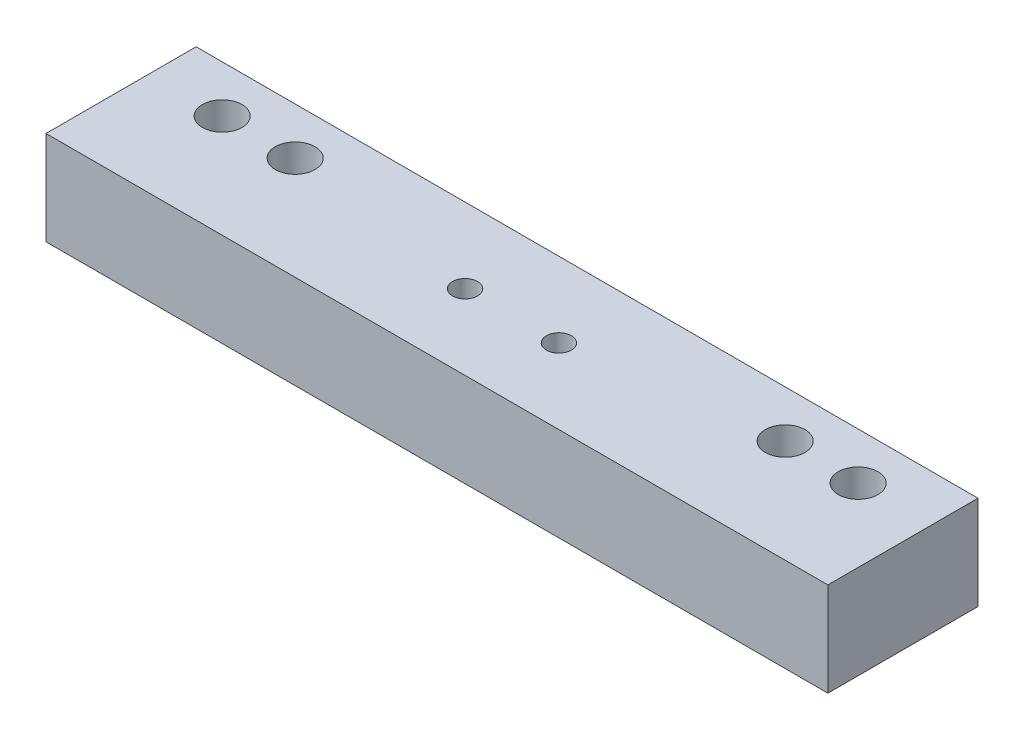
ISO-10303-21;
HEADER;
FILE_DESCRIPTION(('STEP AP214'),'2;1');
FILE_NAME('part.step','',(''),(''),'','','');
FILE_SCHEMA(('AUTOMOTIVE_DESIGN { 1 0 10303 214 1 1 1 1 }'));
ENDSEC;
DATA;
#1=APPLICATION_CONTEXT('core data for automotive mechanical design processes');
#2=APPLICATION_PROTOCOL_DEFINITION('international standard','automotive_design',2000,#1);
#3=PRODUCT_CONTEXT('',#1,'mechanical');
#4=PRODUCT('Part','Part','',(#3));
#5=PRODUCT_RELATED_PRODUCT_CATEGORY('part','',(#4));
#6=PRODUCT_DEFINITION_FORMATION('','',#4);
#7=PRODUCT_DEFINITION_CONTEXT('part definition',#1,'design');
#8=PRODUCT_DEFINITION('design','',#6,#7);
#9=PRODUCT_DEFINITION_SHAPE('','',#8);
#10=(LENGTH_UNIT() NAMED_UNIT(*) SI_UNIT(.MILLI.,.METRE.));
#11=(NAMED_UNIT(*) PLANE_ANGLE_UNIT() SI_UNIT($,.RADIAN.));
#12=(NAMED_UNIT(*) SI_UNIT($,.STERADIAN.) SOLID_ANGLE_UNIT());
#13=UNCERTAINTY_MEASURE_WITH_UNIT(LENGTH_MEASURE(1.E-05),#10,'distance_accuracy_value','');
#14=(GEOMETRIC_REPRESENTATION_CONTEXT(3) GLOBAL_UNCERTAINTY_ASSIGNED_CONTEXT((#13)) GLOBAL_UNIT_ASSIGNED_CONTEXT((#10,
#11,#12)) REPRESENTATION_CONTEXT('',''));
#15=CARTESIAN_POINT('',(0.,0.,0.));
#16=DIRECTION('',(0.,0.,1.));
#17=DIRECTION('',(1.,0.,0.));
#18=AXIS2_PLACEMENT_3D('',#15,#16,#17);
#19=CARTESIAN_POINT('',(0.,15.,0.));
#20=DIRECTION('',(1.,0.,0.));
#21=DIRECTION('',(0.,0.,-1.));
#22=AXIS2_PLACEMENT_3D('',#19,#20,#21);
#23=PLANE('',#22);
#24=DIRECTION('',(0.,0.,1.));
#25=VECTOR('',#24,1.);
#26=CARTESIAN_POINT('',(0.,0.,0.));
#27=LINE('',#26,#25);
#28=CARTESIAN_POINT('',(0.,0.,-24.));
#29=VERTEX_POINT('',#28);
#30=CARTESIAN_POINT('',(0.,0.,0.));
#31=VERTEX_POINT('',#30);
#32=EDGE_CURVE('E95',#29,#31,#27,.T.);
#33=ORIENTED_EDGE('',*,*,#32,.T.);
#34=DIRECTION('',(0.,-1.,0.));
#35=VECTOR('',#34,1.);
#36=CARTESIAN_POINT('',(0.,15.,0.));
#37=LINE('',#36,#35);
#38=CARTESIAN_POINT('',(0.,15.,0.));
#39=VERTEX_POINT('',#38);
#40=EDGE_CURVE('E11',#39,#31,#37,.T.);
#41=ORIENTED_EDGE('',*,*,#40,.F.);
#42=DIRECTION('',(0.,0.,1.));
#43=VECTOR('',#42,1.);
#44=CARTESIAN_POINT('',(0.,15.,0.));
#45=LINE('',#44,#43);
#46=CARTESIAN_POINT('',(0.,15.,-24.));
#47=VERTEX_POINT('',#46);
#48=EDGE_CURVE('E83',#47,#39,#45,.T.);
#49=ORIENTED_EDGE('',*,*,#48,.F.);
#50=DIRECTION('',(0.,-1.,0.));
#51=VECTOR('',#50,1.);
#52=CARTESIAN_POINT('',(0.,15.,-24.));
#53=LINE('',#52,#51);
#54=EDGE_CURVE('E91',#47,#29,#53,.T.);
#55=ORIENTED_EDGE('',*,*,#54,.T.);
#56=EDGE_LOOP('',(#33,#41,#49,#55));
#57=FACE_BOUND('',#56,.T.);
#58=ADVANCED_FACE('F32',(#57),#23,.F.);
#59=CARTESIAN_POINT('',(0.,15.,0.));
#60=DIRECTION('',(0.,0.,-1.));
#61=DIRECTION('',(-1.,0.,0.));
#62=AXIS2_PLACEMENT_3D('',#59,#60,#61);
#63=PLANE('',#62);
#64=DIRECTION('',(1.,0.,0.));
#65=VECTOR('',#64,1.);
#66=CARTESIAN_POINT('',(0.,0.,0.));
#67=LINE('',#66,#65);
#68=CARTESIAN_POINT('',(125.,0.,0.));
#69=VERTEX_POINT('',#68);
#70=EDGE_CURVE('E87',#31,#69,#67,.T.);
#71=ORIENTED_EDGE('',*,*,#70,.T.);
#72=DIRECTION('',(0.,-1.,0.));
#73=VECTOR('',#72,1.);
#74=CARTESIAN_POINT('',(125.,15.,0.));
#75=LINE('',#74,#73);
#76=CARTESIAN_POINT('',(125.,15.,0.));
#77=VERTEX_POINT('',#76);
#78=EDGE_CURVE('E40',#77,#69,#75,.T.);
#79=ORIENTED_EDGE('',*,*,#78,.F.);
#80=DIRECTION('',(1.,0.,0.));
#81=VECTOR('',#80,1.);
#82=CARTESIAN_POINT('',(0.,15.,0.));
#83=LINE('',#82,#81);
#84=EDGE_CURVE('E78',#39,#77,#83,.T.);
#85=ORIENTED_EDGE('',*,*,#84,.F.);
#86=ORIENTED_EDGE('',*,*,#40,.T.);
#87=EDGE_LOOP('',(#71,#79,#85,#86));
#88=FACE_BOUND('',#87,.T.);
#89=ADVANCED_FACE('F86',(#88),#63,.F.);
#90=CARTESIAN_POINT('',(125.,15.,0.));
#91=DIRECTION('',(-1.,0.,0.));
#92=DIRECTION('',(0.,0.,1.));
#93=AXIS2_PLACEMENT_3D('',#90,#91,#92);
#94=PLANE('',#93);
#95=DIRECTION('',(0.,0.,-1.));
#96=VECTOR('',#95,1.);
#97=CARTESIAN_POINT('',(125.,0.,0.));
#98=LINE('',#97,#96);
#99=CARTESIAN_POINT('',(125.,0.,-24.));
#100=VERTEX_POINT('',#99);
#101=EDGE_CURVE('E65',#69,#100,#98,.T.);
#102=ORIENTED_EDGE('',*,*,#101,.T.);
#103=DIRECTION('',(0.,-1.,0.));
#104=VECTOR('',#103,1.);
#105=CARTESIAN_POINT('',(125.,15.,-24.));
#106=LINE('',#105,#104);
#107=CARTESIAN_POINT('',(125.,15.,-24.));
#108=VERTEX_POINT('',#107);
#109=EDGE_CURVE('E88',#108,#100,#106,.T.);
#110=ORIENTED_EDGE('',*,*,#109,.F.);
#111=DIRECTION('',(0.,0.,-1.));
#112=VECTOR('',#111,1.);
#113=CARTESIAN_POINT('',(125.,15.,0.));
#114=LINE('',#113,#112);
#115=EDGE_CURVE('E81',#77,#108,#114,.T.);
#116=ORIENTED_EDGE('',*,*,#115,.F.);
#117=ORIENTED_EDGE('',*,*,#78,.T.);
#118=EDGE_LOOP('',(#102,#110,#116,#117));
#119=FACE_BOUND('',#118,.T.);
#120=ADVANCED_FACE('F89',(#119),#94,.F.);
#121=CARTESIAN_POINT('',(0.,15.,-24.));
#122=DIRECTION('',(0.,0.,1.));
#123=DIRECTION('',(1.,0.,0.));
#124=AXIS2_PLACEMENT_3D('',#121,#122,#123);
#125=PLANE('',#124);
#126=DIRECTION('',(-1.,0.,0.));
#127=VECTOR('',#126,1.);
#128=CARTESIAN_POINT('',(0.,0.,-24.));
#129=LINE('',#128,#127);
#130=EDGE_CURVE('E71',#100,#29,#129,.T.);
#131=ORIENTED_EDGE('',*,*,#130,.T.);
#132=ORIENTED_EDGE('',*,*,#54,.F.);
#133=DIRECTION('',(-1.,0.,0.));
#134=VECTOR('',#133,1.);
#135=CARTESIAN_POINT('',(0.,15.,-24.));
#136=LINE('',#135,#134);
#137=EDGE_CURVE('E48',#108,#47,#136,.T.);
#138=ORIENTED_EDGE('',*,*,#137,.F.);
#139=ORIENTED_EDGE('',*,*,#109,.T.);
#140=EDGE_LOOP('',(#131,#132,#138,#139));
#141=FACE_BOUND('',#140,.T.);
#142=ADVANCED_FACE('F103',(#141),#125,.F.);
#143=CARTESIAN_POINT('',(0.,15.,0.));
#144=DIRECTION('',(0.,-1.,0.));
#145=DIRECTION('',(0.,0.,-1.));
#146=AXIS2_PLACEMENT_3D('',#143,#144,#145);
#147=PLANE('',#146);
#148=CARTESIAN_POINT('',(55.,15.,-12.));
#149=DIRECTION('',(0.,-1.,0.));
#150=DIRECTION('',(0.,0.,1.));
#151=AXIS2_PLACEMENT_3D('',#148,#149,#150);
#152=CIRCLE('',#151,2.);
#153=CARTESIAN_POINT('',(55.,15.,-10.));
#154=VERTEX_POINT('',#153);
#155=EDGE_CURVE('E139',#154,#154,#152,.T.);
#156=ORIENTED_EDGE('',*,*,#155,.T.);
#157=EDGE_LOOP('',(#156));
#158=FACE_BOUND('',#157,.T.);
#159=CARTESIAN_POINT('',(70.,15.,-12.));
#160=DIRECTION('',(0.,1.,0.));
#161=DIRECTION('',(0.,0.,1.));
#162=AXIS2_PLACEMENT_3D('',#159,#160,#161);
#163=CIRCLE('',#162,2.);
#164=CARTESIAN_POINT('',(70.,15.,-10.));
#165=VERTEX_POINT('',#164);
#166=EDGE_CURVE('E133',#165,#165,#163,.T.);
#167=ORIENTED_EDGE('',*,*,#166,.F.);
#168=EDGE_LOOP('',(#167));
#169=FACE_BOUND('',#168,.T.);
#170=CARTESIAN_POINT('',(11.6666666666667,15.,-16.5));
#171=DIRECTION('',(0.,-1.,0.));
#172=DIRECTION('',(0.,0.,-1.));
#173=AXIS2_PLACEMENT_3D('',#170,#171,#172);
#174=CIRCLE('',#173,3.175);
#175=CARTESIAN_POINT('',(11.6666666666667,15.,-19.675));
#176=VERTEX_POINT('',#175);
#177=EDGE_CURVE('E118',#176,#176,#174,.F.);
#178=ORIENTED_EDGE('',*,*,#177,.F.);
#179=EDGE_LOOP('',(#178));
#180=FACE_BOUND('',#179,.T.);
#181=CARTESIAN_POINT('',(23.3333333333333,15.,-16.5));
#182=DIRECTION('',(0.,-1.,0.));
#183=DIRECTION('',(0.,0.,-1.));
#184=AXIS2_PLACEMENT_3D('',#181,#182,#183);
#185=CIRCLE('',#184,3.175);
#186=CARTESIAN_POINT('',(23.3333333333333,15.,-19.675));
#187=VERTEX_POINT('',#186);
#188=EDGE_CURVE('E123',#187,#187,#185,.F.);
#189=ORIENTED_EDGE('',*,*,#188,.F.);
#190=EDGE_LOOP('',(#189));
#191=FACE_BOUND('',#190,.T.);
#192=CARTESIAN_POINT('',(113.333333333333,15.,-16.5));
#193=DIRECTION('',(0.,-1.,0.));
#194=DIRECTION('',(0.,0.,-1.));
#195=AXIS2_PLACEMENT_3D('',#192,#193,#194);
#196=CIRCLE('',#195,3.175);
#197=CARTESIAN_POINT('',(113.333333333333,15.,-19.675));
#198=VERTEX_POINT('',#197);
#199=EDGE_CURVE('E98',#198,#198,#196,.T.);
#200=ORIENTED_EDGE('',*,*,#199,.T.);
#201=EDGE_LOOP('',(#200));
#202=FACE_BOUND('',#201,.T.);
#203=CARTESIAN_POINT('',(101.666666666667,15.,-16.5));
#204=DIRECTION('',(0.,-1.,0.));
#205=DIRECTION('',(0.,0.,-1.));
#206=AXIS2_PLACEMENT_3D('',#203,#204,#205);
#207=CIRCLE('',#206,3.175);
#208=CARTESIAN_POINT('',(101.666666666667,15.,-19.675));
#209=VERTEX_POINT('',#208);
#210=EDGE_CURVE('E111',#209,#209,#207,.T.);
#211=ORIENTED_EDGE('',*,*,#210,.T.);
#212=EDGE_LOOP('',(#211));
#213=FACE_BOUND('',#212,.T.);
#214=ORIENTED_EDGE('',*,*,#48,.T.);
#215=ORIENTED_EDGE('',*,*,#84,.T.);
#216=ORIENTED_EDGE('',*,*,#115,.T.);
#217=ORIENTED_EDGE('',*,*,#137,.T.);
#218=EDGE_LOOP('',(#214,#215,#216,#217));
#219=FACE_BOUND('',#218,.T.);
#220=ADVANCED_FACE('F79',(#158,#169,#180,#191,#202,#213,#219),#147,.F.);
#221=CARTESIAN_POINT('',(0.,0.,0.));
#222=DIRECTION('',(0.,-1.,0.));
#223=DIRECTION('',(0.,0.,-1.));
#224=AXIS2_PLACEMENT_3D('',#221,#222,#223);
#225=PLANE('',#224);
#226=CARTESIAN_POINT('',(55.,0.,-12.));
#227=DIRECTION('',(0.,-1.,0.));
#228=DIRECTION('',(0.,0.,1.));
#229=AXIS2_PLACEMENT_3D('',#226,#227,#228);
#230=CIRCLE('',#229,2.);
#231=CARTESIAN_POINT('',(55.,0.,-10.));
#232=VERTEX_POINT('',#231);
#233=EDGE_CURVE('E136',#232,#232,#230,.T.);
#234=ORIENTED_EDGE('',*,*,#233,.F.);
#235=EDGE_LOOP('',(#234));
#236=FACE_BOUND('',#235,.T.);
#237=CARTESIAN_POINT('',(70.,0.,-12.));
#238=DIRECTION('',(0.,1.,0.));
#239=DIRECTION('',(0.,0.,1.));
#240=AXIS2_PLACEMENT_3D('',#237,#238,#239);
#241=CIRCLE('',#240,2.);
#242=CARTESIAN_POINT('',(70.,0.,-10.));
#243=VERTEX_POINT('',#242);
#244=EDGE_CURVE('E130',#243,#243,#241,.T.);
#245=ORIENTED_EDGE('',*,*,#244,.T.);
#246=EDGE_LOOP('',(#245));
#247=FACE_BOUND('',#246,.T.);
#248=CARTESIAN_POINT('',(11.6666666666667,0.,-16.5));
#249=DIRECTION('',(0.,-1.,0.));
#250=DIRECTION('',(0.,0.,1.));
#251=AXIS2_PLACEMENT_3D('',#248,#249,#250);
#252=CIRCLE('',#251,3.175);
#253=CARTESIAN_POINT('',(11.6666666666667,0.,-13.325));
#254=VERTEX_POINT('',#253);
#255=EDGE_CURVE('E126',#254,#254,#252,.T.);
#256=ORIENTED_EDGE('',*,*,#255,.F.);
#257=EDGE_LOOP('',(#256));
#258=FACE_BOUND('',#257,.T.);
#259=CARTESIAN_POINT('',(23.3333333333333,0.,-16.5));
#260=DIRECTION('',(0.,-1.,0.));
#261=DIRECTION('',(0.,0.,1.));
#262=AXIS2_PLACEMENT_3D('',#259,#260,#261);
#263=CIRCLE('',#262,3.175);
#264=CARTESIAN_POINT('',(23.3333333333333,0.,-13.325));
#265=VERTEX_POINT('',#264);
#266=EDGE_CURVE('E127',#265,#265,#263,.T.);
#267=ORIENTED_EDGE('',*,*,#266,.F.);
#268=EDGE_LOOP('',(#267));
#269=FACE_BOUND('',#268,.T.);
#270=CARTESIAN_POINT('',(113.333333333333,0.,-16.5));
#271=DIRECTION('',(0.,1.,0.));
#272=DIRECTION('',(0.,0.,1.));
#273=AXIS2_PLACEMENT_3D('',#270,#271,#272);
#274=CIRCLE('',#273,3.175);
#275=CARTESIAN_POINT('',(113.333333333333,0.,-13.325));
#276=VERTEX_POINT('',#275);
#277=EDGE_CURVE('E114',#276,#276,#274,.T.);
#278=ORIENTED_EDGE('',*,*,#277,.T.);
#279=EDGE_LOOP('',(#278));
#280=FACE_BOUND('',#279,.T.);
#281=CARTESIAN_POINT('',(101.666666666667,0.,-16.5));
#282=DIRECTION('',(0.,1.,0.));
#283=DIRECTION('',(0.,0.,1.));
#284=AXIS2_PLACEMENT_3D('',#281,#282,#283);
#285=CIRCLE('',#284,3.175);
#286=CARTESIAN_POINT('',(101.666666666667,0.,-13.325));
#287=VERTEX_POINT('',#286);
#288=EDGE_CURVE('E115',#287,#287,#285,.T.);
#289=ORIENTED_EDGE('',*,*,#288,.T.);
#290=EDGE_LOOP('',(#289));
#291=FACE_BOUND('',#290,.T.);
#292=ORIENTED_EDGE('',*,*,#32,.F.);
#293=ORIENTED_EDGE('',*,*,#130,.F.);
#294=ORIENTED_EDGE('',*,*,#101,.F.);
#295=ORIENTED_EDGE('',*,*,#70,.F.);
#296=EDGE_LOOP('',(#292,#293,#294,#295));
#297=FACE_BOUND('',#296,.T.);
#298=ADVANCED_FACE('F106',(#236,#247,#258,#269,#280,#291,#297),#225,.T.);
#299=CARTESIAN_POINT('',(101.666666666667,0.,-16.5));
#300=DIRECTION('',(0.,1.,0.));
#301=DIRECTION('',(0.,0.,1.));
#302=AXIS2_PLACEMENT_3D('',#299,#300,#301);
#303=CYLINDRICAL_SURFACE('',#302,3.175);
#304=ORIENTED_EDGE('',*,*,#288,.F.);
#305=EDGE_LOOP('',(#304));
#306=FACE_BOUND('',#305,.T.);
#307=ORIENTED_EDGE('',*,*,#210,.F.);
#308=EDGE_LOOP('',(#307));
#309=FACE_BOUND('',#308,.T.);
#310=ADVANCED_FACE('F150',(#306,#309),#303,.F.);
#311=CARTESIAN_POINT('',(113.333333333333,0.,-16.5));
#312=DIRECTION('',(0.,1.,0.));
#313=DIRECTION('',(0.,0.,1.));
#314=AXIS2_PLACEMENT_3D('',#311,#312,#313);
#315=CYLINDRICAL_SURFACE('',#314,3.175);
#316=ORIENTED_EDGE('',*,*,#277,.F.);
#317=EDGE_LOOP('',(#316));
#318=FACE_BOUND('',#317,.T.);
#319=ORIENTED_EDGE('',*,*,#199,.F.);
#320=EDGE_LOOP('',(#319));
#321=FACE_BOUND('',#320,.T.);
#322=ADVANCED_FACE('F164',(#318,#321),#315,.F.);
#323=CARTESIAN_POINT('',(23.3333333333333,0.,-16.5));
#324=DIRECTION('',(0.,1.,0.));
#325=DIRECTION('',(0.,0.,1.));
#326=AXIS2_PLACEMENT_3D('',#323,#324,#325);
#327=CYLINDRICAL_SURFACE('',#326,3.175);
#328=ORIENTED_EDGE('',*,*,#266,.T.);
#329=EDGE_LOOP('',(#328));
#330=FACE_BOUND('',#329,.T.);
#331=ORIENTED_EDGE('',*,*,#188,.T.);
#332=EDGE_LOOP('',(#331));
#333=FACE_BOUND('',#332,.T.);
#334=ADVANCED_FACE('F212',(#330,#333),#327,.F.);
#335=CARTESIAN_POINT('',(11.6666666666667,0.,-16.5));
#336=DIRECTION('',(0.,1.,0.));
#337=DIRECTION('',(0.,0.,1.));
#338=AXIS2_PLACEMENT_3D('',#335,#336,#337);
#339=CYLINDRICAL_SURFACE('',#338,3.175);
#340=ORIENTED_EDGE('',*,*,#255,.T.);
#341=EDGE_LOOP('',(#340));
#342=FACE_BOUND('',#341,.T.);
#343=ORIENTED_EDGE('',*,*,#177,.T.);
#344=EDGE_LOOP('',(#343));
#345=FACE_BOUND('',#344,.T.);
#346=ADVANCED_FACE('F220',(#342,#345),#339,.F.);
#347=CARTESIAN_POINT('',(70.,0.,-12.));
#348=DIRECTION('',(0.,1.,0.));
#349=DIRECTION('',(0.,0.,1.));
#350=AXIS2_PLACEMENT_3D('',#347,#348,#349);
#351=CYLINDRICAL_SURFACE('',#350,2.);
#352=ORIENTED_EDGE('',*,*,#244,.F.);
#353=EDGE_LOOP('',(#352));
#354=FACE_BOUND('',#353,.T.);
#355=ORIENTED_EDGE('',*,*,#166,.T.);
#356=EDGE_LOOP('',(#355));
#357=FACE_BOUND('',#356,.T.);
#358=ADVANCED_FACE('F228',(#354,#357),#351,.F.);
#359=CARTESIAN_POINT('',(55.,0.,-12.));
#360=DIRECTION('',(0.,1.,0.));
#361=DIRECTION('',(0.,0.,1.));
#362=AXIS2_PLACEMENT_3D('',#359,#360,#361);
#363=CYLINDRICAL_SURFACE('',#362,2.);
#364=ORIENTED_EDGE('',*,*,#233,.T.);
#365=EDGE_LOOP('',(#364));
#366=FACE_BOUND('',#365,.T.);
#367=ORIENTED_EDGE('',*,*,#155,.F.);
#368=EDGE_LOOP('',(#367));
#369=FACE_BOUND('',#368,.T.);
#370=ADVANCED_FACE('F145',(#366,#369),#363,.F.);
#371=CLOSED_SHELL('',(#58,#89,#120,#142,#220,#298,#310,#322,#334,#346,#358,#370));
#372=MANIFOLD_SOLID_BREP('B2',#371);
#373=ADVANCED_BREP_SHAPE_REPRESENTATION('',(#18,#372),#14);
#374=SHAPE_DEFINITION_REPRESENTATION(#9,#373);
ENDSEC;
END-ISO-10303-21;
